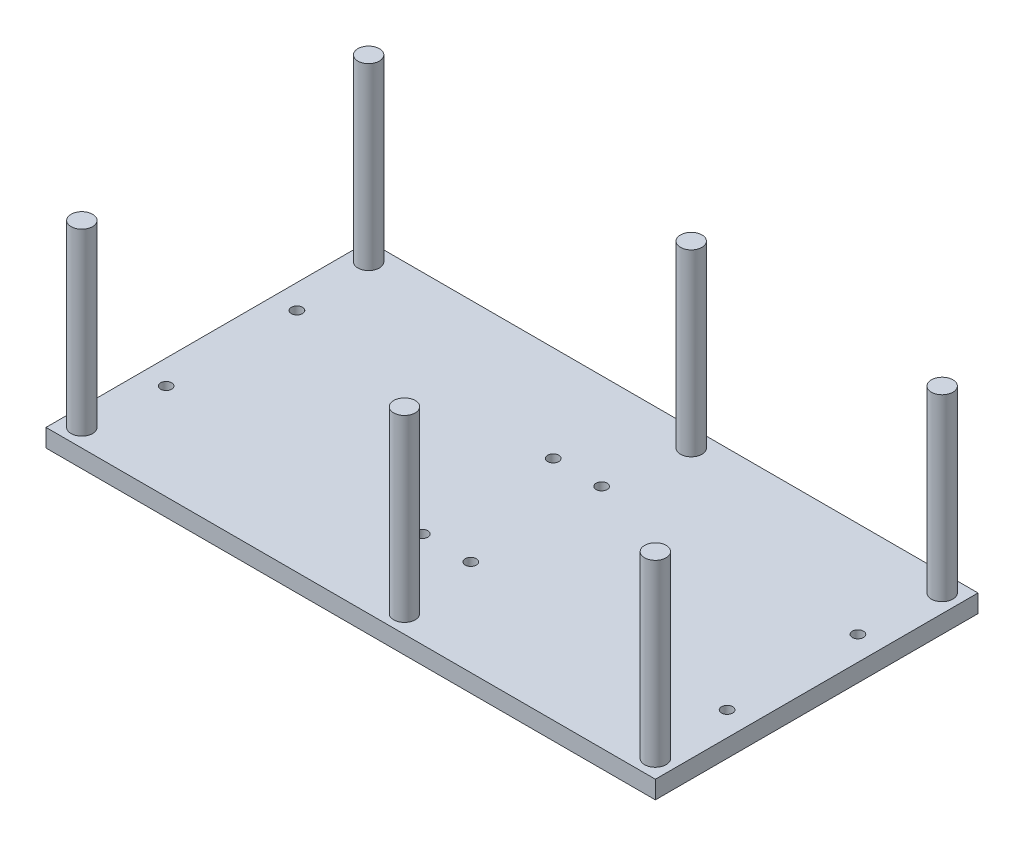
ISO-10303-21;
HEADER;
FILE_DESCRIPTION(('STEP AP214'),'2;1');
FILE_NAME('part.step','',(''),(''),'','','');
FILE_SCHEMA(('AUTOMOTIVE_DESIGN { 1 0 10303 214 1 1 1 1 }'));
ENDSEC;
DATA;
#1=APPLICATION_CONTEXT('core data for automotive mechanical design processes');
#2=APPLICATION_PROTOCOL_DEFINITION('international standard','automotive_design',2000,#1);
#3=PRODUCT_CONTEXT('',#1,'mechanical');
#4=PRODUCT('Part','Part','',(#3));
#5=PRODUCT_RELATED_PRODUCT_CATEGORY('part','',(#4));
#6=PRODUCT_DEFINITION_FORMATION('','',#4);
#7=PRODUCT_DEFINITION_CONTEXT('part definition',#1,'design');
#8=PRODUCT_DEFINITION('design','',#6,#7);
#9=PRODUCT_DEFINITION_SHAPE('','',#8);
#10=(LENGTH_UNIT() NAMED_UNIT(*) SI_UNIT(.MILLI.,.METRE.));
#11=(NAMED_UNIT(*) PLANE_ANGLE_UNIT() SI_UNIT($,.RADIAN.));
#12=(NAMED_UNIT(*) SI_UNIT($,.STERADIAN.) SOLID_ANGLE_UNIT());
#13=UNCERTAINTY_MEASURE_WITH_UNIT(LENGTH_MEASURE(1.E-05),#10,'distance_accuracy_value','');
#14=(GEOMETRIC_REPRESENTATION_CONTEXT(3) GLOBAL_UNCERTAINTY_ASSIGNED_CONTEXT((#13)) GLOBAL_UNIT_ASSIGNED_CONTEXT((#10,
#11,#12)) REPRESENTATION_CONTEXT('',''));
#15=CARTESIAN_POINT('',(0.,0.,0.));
#16=DIRECTION('',(0.,0.,1.));
#17=DIRECTION('',(1.,0.,0.));
#18=AXIS2_PLACEMENT_3D('',#15,#16,#17);
#19=CARTESIAN_POINT('',(0.,5.,0.));
#20=DIRECTION('',(1.,0.,0.));
#21=DIRECTION('',(0.,0.,-1.));
#22=AXIS2_PLACEMENT_3D('',#19,#20,#21);
#23=PLANE('',#22);
#24=DIRECTION('',(0.,0.,1.));
#25=VECTOR('',#24,1.);
#26=CARTESIAN_POINT('',(0.,0.,0.));
#27=LINE('',#26,#25);
#28=CARTESIAN_POINT('',(0.,0.,-90.));
#29=VERTEX_POINT('',#28);
#30=CARTESIAN_POINT('',(0.,0.,0.));
#31=VERTEX_POINT('',#30);
#32=EDGE_CURVE('E115',#29,#31,#27,.T.);
#33=ORIENTED_EDGE('',*,*,#32,.T.);
#34=DIRECTION('',(0.,-1.,0.));
#35=VECTOR('',#34,1.);
#36=CARTESIAN_POINT('',(0.,5.,0.));
#37=LINE('',#36,#35);
#38=CARTESIAN_POINT('',(0.,5.,0.));
#39=VERTEX_POINT('',#38);
#40=EDGE_CURVE('E104',#39,#31,#37,.T.);
#41=ORIENTED_EDGE('',*,*,#40,.F.);
#42=DIRECTION('',(0.,0.,1.));
#43=VECTOR('',#42,1.);
#44=CARTESIAN_POINT('',(0.,5.,0.));
#45=LINE('',#44,#43);
#46=CARTESIAN_POINT('',(0.,5.,-90.));
#47=VERTEX_POINT('',#46);
#48=EDGE_CURVE('E96',#47,#39,#45,.T.);
#49=ORIENTED_EDGE('',*,*,#48,.F.);
#50=DIRECTION('',(0.,-1.,0.));
#51=VECTOR('',#50,1.);
#52=CARTESIAN_POINT('',(0.,5.,-90.));
#53=LINE('',#52,#51);
#54=EDGE_CURVE('E111',#47,#29,#53,.T.);
#55=ORIENTED_EDGE('',*,*,#54,.T.);
#56=EDGE_LOOP('',(#33,#41,#49,#55));
#57=FACE_BOUND('',#56,.T.);
#58=ADVANCED_FACE('F43',(#57),#23,.F.);
#59=CARTESIAN_POINT('',(0.,5.,0.));
#60=DIRECTION('',(0.,0.,-1.));
#61=DIRECTION('',(-1.,0.,0.));
#62=AXIS2_PLACEMENT_3D('',#59,#60,#61);
#63=PLANE('',#62);
#64=DIRECTION('',(1.,0.,0.));
#65=VECTOR('',#64,1.);
#66=CARTESIAN_POINT('',(0.,0.,0.));
#67=LINE('',#66,#65);
#68=CARTESIAN_POINT('',(170.,0.,0.));
#69=VERTEX_POINT('',#68);
#70=EDGE_CURVE('E102',#31,#69,#67,.T.);
#71=ORIENTED_EDGE('',*,*,#70,.T.);
#72=DIRECTION('',(0.,-1.,0.));
#73=VECTOR('',#72,1.);
#74=CARTESIAN_POINT('',(170.,5.,0.));
#75=LINE('',#74,#73);
#76=CARTESIAN_POINT('',(170.,5.,0.));
#77=VERTEX_POINT('',#76);
#78=EDGE_CURVE('E100',#77,#69,#75,.T.);
#79=ORIENTED_EDGE('',*,*,#78,.F.);
#80=DIRECTION('',(1.,0.,0.));
#81=VECTOR('',#80,1.);
#82=CARTESIAN_POINT('',(0.,5.,0.));
#83=LINE('',#82,#81);
#84=EDGE_CURVE('E91',#39,#77,#83,.T.);
#85=ORIENTED_EDGE('',*,*,#84,.F.);
#86=ORIENTED_EDGE('',*,*,#40,.T.);
#87=EDGE_LOOP('',(#71,#79,#85,#86));
#88=FACE_BOUND('',#87,.T.);
#89=ADVANCED_FACE('F101',(#88),#63,.F.);
#90=CARTESIAN_POINT('',(170.,5.,0.));
#91=DIRECTION('',(-1.,0.,0.));
#92=DIRECTION('',(0.,0.,1.));
#93=AXIS2_PLACEMENT_3D('',#90,#91,#92);
#94=PLANE('',#93);
#95=DIRECTION('',(0.,0.,-1.));
#96=VECTOR('',#95,1.);
#97=CARTESIAN_POINT('',(170.,0.,0.));
#98=LINE('',#97,#96);
#99=CARTESIAN_POINT('',(170.,0.,-90.));
#100=VERTEX_POINT('',#99);
#101=EDGE_CURVE('E77',#69,#100,#98,.T.);
#102=ORIENTED_EDGE('',*,*,#101,.T.);
#103=DIRECTION('',(0.,-1.,0.));
#104=VECTOR('',#103,1.);
#105=CARTESIAN_POINT('',(170.,5.,-90.));
#106=LINE('',#105,#104);
#107=CARTESIAN_POINT('',(170.,5.,-90.));
#108=VERTEX_POINT('',#107);
#109=EDGE_CURVE('E105',#108,#100,#106,.T.);
#110=ORIENTED_EDGE('',*,*,#109,.F.);
#111=DIRECTION('',(0.,0.,-1.));
#112=VECTOR('',#111,1.);
#113=CARTESIAN_POINT('',(170.,5.,0.));
#114=LINE('',#113,#112);
#115=EDGE_CURVE('E94',#77,#108,#114,.T.);
#116=ORIENTED_EDGE('',*,*,#115,.F.);
#117=ORIENTED_EDGE('',*,*,#78,.T.);
#118=EDGE_LOOP('',(#102,#110,#116,#117));
#119=FACE_BOUND('',#118,.T.);
#120=ADVANCED_FACE('F107',(#119),#94,.F.);
#121=CARTESIAN_POINT('',(0.,5.,-90.));
#122=DIRECTION('',(0.,0.,1.));
#123=DIRECTION('',(1.,0.,0.));
#124=AXIS2_PLACEMENT_3D('',#121,#122,#123);
#125=PLANE('',#124);
#126=DIRECTION('',(-1.,0.,0.));
#127=VECTOR('',#126,1.);
#128=CARTESIAN_POINT('',(0.,0.,-90.));
#129=LINE('',#128,#127);
#130=EDGE_CURVE('E83',#100,#29,#129,.T.);
#131=ORIENTED_EDGE('',*,*,#130,.T.);
#132=ORIENTED_EDGE('',*,*,#54,.F.);
#133=DIRECTION('',(-1.,0.,0.));
#134=VECTOR('',#133,1.);
#135=CARTESIAN_POINT('',(0.,5.,-90.));
#136=LINE('',#135,#134);
#137=EDGE_CURVE('E60',#108,#47,#136,.T.);
#138=ORIENTED_EDGE('',*,*,#137,.F.);
#139=ORIENTED_EDGE('',*,*,#109,.T.);
#140=EDGE_LOOP('',(#131,#132,#138,#139));
#141=FACE_BOUND('',#140,.T.);
#142=ADVANCED_FACE('F156',(#141),#125,.F.);
#143=CARTESIAN_POINT('',(0.,5.,0.));
#144=DIRECTION('',(0.,-1.,0.));
#145=DIRECTION('',(0.,0.,-1.));
#146=AXIS2_PLACEMENT_3D('',#143,#144,#145);
#147=PLANE('',#146);
#148=CARTESIAN_POINT('',(163.25,5.,-63.25));
#149=DIRECTION('',(0.,-1.,0.));
#150=DIRECTION('',(0.,0.,-1.));
#151=AXIS2_PLACEMENT_3D('',#148,#149,#150);
#152=CIRCLE('',#151,1.55000000000002);
#153=CARTESIAN_POINT('',(163.25,5.,-64.8));
#154=VERTEX_POINT('',#153);
#155=EDGE_CURVE('E473',#154,#154,#152,.T.);
#156=ORIENTED_EDGE('',*,*,#155,.T.);
#157=EDGE_LOOP('',(#156));
#158=FACE_BOUND('',#157,.T.);
#159=CARTESIAN_POINT('',(6.75000000000001,5.,-63.25));
#160=DIRECTION('',(0.,-1.,0.));
#161=DIRECTION('',(0.,0.,-1.));
#162=AXIS2_PLACEMENT_3D('',#159,#160,#161);
#163=CIRCLE('',#162,1.55);
#164=CARTESIAN_POINT('',(6.75000000000001,5.,-64.8));
#165=VERTEX_POINT('',#164);
#166=EDGE_CURVE('E476',#165,#165,#163,.T.);
#167=ORIENTED_EDGE('',*,*,#166,.T.);
#168=EDGE_LOOP('',(#167));
#169=FACE_BOUND('',#168,.T.);
#170=CARTESIAN_POINT('',(78.25,5.,-63.25));
#171=DIRECTION('',(0.,-1.,0.));
#172=DIRECTION('',(0.,0.,-1.));
#173=AXIS2_PLACEMENT_3D('',#170,#171,#172);
#174=CIRCLE('',#173,1.54999999999999);
#175=CARTESIAN_POINT('',(78.25,5.,-64.8));
#176=VERTEX_POINT('',#175);
#177=EDGE_CURVE('E484',#176,#176,#174,.T.);
#178=ORIENTED_EDGE('',*,*,#177,.T.);
#179=EDGE_LOOP('',(#178));
#180=FACE_BOUND('',#179,.T.);
#181=CARTESIAN_POINT('',(78.25,5.,-26.75));
#182=DIRECTION('',(0.,-1.,0.));
#183=DIRECTION('',(0.,0.,-1.));
#184=AXIS2_PLACEMENT_3D('',#181,#182,#183);
#185=CIRCLE('',#184,1.54999999999999);
#186=CARTESIAN_POINT('',(78.25,5.,-28.3));
#187=VERTEX_POINT('',#186);
#188=EDGE_CURVE('E516',#187,#187,#185,.T.);
#189=ORIENTED_EDGE('',*,*,#188,.T.);
#190=EDGE_LOOP('',(#189));
#191=FACE_BOUND('',#190,.T.);
#192=CARTESIAN_POINT('',(91.75,5.,-63.2499999999999));
#193=DIRECTION('',(0.,-1.,0.));
#194=DIRECTION('',(0.,0.,-1.));
#195=AXIS2_PLACEMENT_3D('',#192,#193,#194);
#196=CIRCLE('',#195,1.54999999999999);
#197=CARTESIAN_POINT('',(91.75,5.,-64.7999999999999));
#198=VERTEX_POINT('',#197);
#199=EDGE_CURVE('E520',#198,#198,#196,.T.);
#200=ORIENTED_EDGE('',*,*,#199,.T.);
#201=EDGE_LOOP('',(#200));
#202=FACE_BOUND('',#201,.T.);
#203=CARTESIAN_POINT('',(91.75,5.,-26.75));
#204=DIRECTION('',(0.,-1.,0.));
#205=DIRECTION('',(0.,0.,-1.));
#206=AXIS2_PLACEMENT_3D('',#203,#204,#205);
#207=CIRCLE('',#206,1.54999999999999);
#208=CARTESIAN_POINT('',(91.75,5.,-28.3));
#209=VERTEX_POINT('',#208);
#210=EDGE_CURVE('E524',#209,#209,#207,.T.);
#211=ORIENTED_EDGE('',*,*,#210,.T.);
#212=EDGE_LOOP('',(#211));
#213=FACE_BOUND('',#212,.T.);
#214=CARTESIAN_POINT('',(163.25,5.,-26.75));
#215=DIRECTION('',(0.,-1.,0.));
#216=DIRECTION('',(0.,0.,-1.));
#217=AXIS2_PLACEMENT_3D('',#214,#215,#216);
#218=CIRCLE('',#217,1.54999999999999);
#219=CARTESIAN_POINT('',(163.25,5.,-28.3));
#220=VERTEX_POINT('',#219);
#221=EDGE_CURVE('E528',#220,#220,#218,.T.);
#222=ORIENTED_EDGE('',*,*,#221,.T.);
#223=EDGE_LOOP('',(#222));
#224=FACE_BOUND('',#223,.T.);
#225=CARTESIAN_POINT('',(6.75,5.,-26.75));
#226=DIRECTION('',(0.,-1.,0.));
#227=DIRECTION('',(0.,0.,-1.));
#228=AXIS2_PLACEMENT_3D('',#225,#226,#227);
#229=CIRCLE('',#228,1.55);
#230=CARTESIAN_POINT('',(6.75,5.,-28.3));
#231=VERTEX_POINT('',#230);
#232=EDGE_CURVE('E532',#231,#231,#229,.T.);
#233=ORIENTED_EDGE('',*,*,#232,.T.);
#234=EDGE_LOOP('',(#233));
#235=FACE_BOUND('',#234,.T.);
#236=CARTESIAN_POINT('',(95.,5.,-5.));
#237=DIRECTION('',(0.,-1.,0.));
#238=DIRECTION('',(0.,0.,-1.));
#239=AXIS2_PLACEMENT_3D('',#236,#237,#238);
#240=CIRCLE('',#239,3.00000000000001);
#241=CARTESIAN_POINT('',(95.,5.,-8.00000000000001));
#242=VERTEX_POINT('',#241);
#243=EDGE_CURVE('E11',#242,#242,#240,.F.);
#244=ORIENTED_EDGE('',*,*,#243,.F.);
#245=EDGE_LOOP('',(#244));
#246=FACE_BOUND('',#245,.T.);
#247=CARTESIAN_POINT('',(95.,5.,-85.));
#248=DIRECTION('',(0.,-1.,0.));
#249=DIRECTION('',(0.,0.,-1.));
#250=AXIS2_PLACEMENT_3D('',#247,#248,#249);
#251=CIRCLE('',#250,3.00000000000001);
#252=CARTESIAN_POINT('',(95.,5.,-88.));
#253=VERTEX_POINT('',#252);
#254=EDGE_CURVE('E52',#253,#253,#251,.F.);
#255=ORIENTED_EDGE('',*,*,#254,.F.);
#256=EDGE_LOOP('',(#255));
#257=FACE_BOUND('',#256,.T.);
#258=CARTESIAN_POINT('',(165.,5.,-85.));
#259=DIRECTION('',(0.,-1.,0.));
#260=DIRECTION('',(0.,0.,-1.));
#261=AXIS2_PLACEMENT_3D('',#258,#259,#260);
#262=CIRCLE('',#261,2.99999999999999);
#263=CARTESIAN_POINT('',(165.,5.,-88.));
#264=VERTEX_POINT('',#263);
#265=EDGE_CURVE('E144',#264,#264,#262,.F.);
#266=ORIENTED_EDGE('',*,*,#265,.F.);
#267=EDGE_LOOP('',(#266));
#268=FACE_BOUND('',#267,.T.);
#269=CARTESIAN_POINT('',(165.,5.,-5.00000000000009));
#270=DIRECTION('',(0.,-1.,0.));
#271=DIRECTION('',(0.,0.,-1.));
#272=AXIS2_PLACEMENT_3D('',#269,#270,#271);
#273=CIRCLE('',#272,2.99999999999997);
#274=CARTESIAN_POINT('',(165.,5.,-8.00000000000006));
#275=VERTEX_POINT('',#274);
#276=EDGE_CURVE('E140',#275,#275,#273,.F.);
#277=ORIENTED_EDGE('',*,*,#276,.F.);
#278=EDGE_LOOP('',(#277));
#279=FACE_BOUND('',#278,.T.);
#280=CARTESIAN_POINT('',(4.99999999999999,5.,-5.00000000000003));
#281=DIRECTION('',(0.,-1.,0.));
#282=DIRECTION('',(0.,0.,-1.));
#283=AXIS2_PLACEMENT_3D('',#280,#281,#282);
#284=CIRCLE('',#283,3.);
#285=CARTESIAN_POINT('',(4.99999999999999,5.,-8.00000000000003));
#286=VERTEX_POINT('',#285);
#287=EDGE_CURVE('E136',#286,#286,#284,.F.);
#288=ORIENTED_EDGE('',*,*,#287,.F.);
#289=EDGE_LOOP('',(#288));
#290=FACE_BOUND('',#289,.T.);
#291=CARTESIAN_POINT('',(5.,5.,-85.));
#292=DIRECTION('',(0.,-1.,0.));
#293=DIRECTION('',(0.,0.,-1.));
#294=AXIS2_PLACEMENT_3D('',#291,#292,#293);
#295=CIRCLE('',#294,3.);
#296=CARTESIAN_POINT('',(5.,5.,-88.));
#297=VERTEX_POINT('',#296);
#298=EDGE_CURVE('E132',#297,#297,#295,.F.);
#299=ORIENTED_EDGE('',*,*,#298,.F.);
#300=EDGE_LOOP('',(#299));
#301=FACE_BOUND('',#300,.T.);
#302=ORIENTED_EDGE('',*,*,#48,.T.);
#303=ORIENTED_EDGE('',*,*,#84,.T.);
#304=ORIENTED_EDGE('',*,*,#115,.T.);
#305=ORIENTED_EDGE('',*,*,#137,.T.);
#306=EDGE_LOOP('',(#302,#303,#304,#305));
#307=FACE_BOUND('',#306,.T.);
#308=ADVANCED_FACE('F92',(#158,#169,#180,#191,#202,#213,#224,#235,#246,#257,#268,#279,#290,#301,
#307),#147,.F.);
#309=CARTESIAN_POINT('',(0.,0.,0.));
#310=DIRECTION('',(0.,-1.,0.));
#311=DIRECTION('',(0.,0.,-1.));
#312=AXIS2_PLACEMENT_3D('',#309,#310,#311);
#313=PLANE('',#312);
#314=CARTESIAN_POINT('',(163.25,0.,-63.25));
#315=DIRECTION('',(0.,-1.,0.));
#316=DIRECTION('',(0.,0.,1.));
#317=AXIS2_PLACEMENT_3D('',#314,#315,#316);
#318=CIRCLE('',#317,1.55000000000002);
#319=CARTESIAN_POINT('',(163.25,0.,-61.6999999999999));
#320=VERTEX_POINT('',#319);
#321=EDGE_CURVE('E470',#320,#320,#318,.T.);
#322=ORIENTED_EDGE('',*,*,#321,.F.);
#323=EDGE_LOOP('',(#322));
#324=FACE_BOUND('',#323,.T.);
#325=CARTESIAN_POINT('',(6.75000000000001,0.,-63.25));
#326=DIRECTION('',(0.,-1.,0.));
#327=DIRECTION('',(0.,0.,-1.));
#328=AXIS2_PLACEMENT_3D('',#325,#326,#327);
#329=CIRCLE('',#328,1.55);
#330=CARTESIAN_POINT('',(6.75000000000001,0.,-64.8));
#331=VERTEX_POINT('',#330);
#332=EDGE_CURVE('E545',#331,#331,#329,.T.);
#333=ORIENTED_EDGE('',*,*,#332,.F.);
#334=EDGE_LOOP('',(#333));
#335=FACE_BOUND('',#334,.T.);
#336=CARTESIAN_POINT('',(78.25,0.,-63.25));
#337=DIRECTION('',(0.,-1.,0.));
#338=DIRECTION('',(0.,0.,-1.));
#339=AXIS2_PLACEMENT_3D('',#336,#337,#338);
#340=CIRCLE('',#339,1.54999999999999);
#341=CARTESIAN_POINT('',(78.25,0.,-64.8));
#342=VERTEX_POINT('',#341);
#343=EDGE_CURVE('E541',#342,#342,#340,.T.);
#344=ORIENTED_EDGE('',*,*,#343,.F.);
#345=EDGE_LOOP('',(#344));
#346=FACE_BOUND('',#345,.T.);
#347=CARTESIAN_POINT('',(78.25,0.,-26.75));
#348=DIRECTION('',(0.,-1.,0.));
#349=DIRECTION('',(0.,0.,-1.));
#350=AXIS2_PLACEMENT_3D('',#347,#348,#349);
#351=CIRCLE('',#350,1.54999999999999);
#352=CARTESIAN_POINT('',(78.25,0.,-28.3));
#353=VERTEX_POINT('',#352);
#354=EDGE_CURVE('E540',#353,#353,#351,.T.);
#355=ORIENTED_EDGE('',*,*,#354,.F.);
#356=EDGE_LOOP('',(#355));
#357=FACE_BOUND('',#356,.T.);
#358=CARTESIAN_POINT('',(91.75,0.,-63.2499999999999));
#359=DIRECTION('',(0.,-1.,0.));
#360=DIRECTION('',(0.,0.,1.));
#361=AXIS2_PLACEMENT_3D('',#358,#359,#360);
#362=CIRCLE('',#361,1.54999999999999);
#363=CARTESIAN_POINT('',(91.75,0.,-61.6999999999999));
#364=VERTEX_POINT('',#363);
#365=EDGE_CURVE('E551',#364,#364,#362,.T.);
#366=ORIENTED_EDGE('',*,*,#365,.F.);
#367=EDGE_LOOP('',(#366));
#368=FACE_BOUND('',#367,.T.);
#369=CARTESIAN_POINT('',(91.75,0.,-26.75));
#370=DIRECTION('',(0.,-1.,0.));
#371=DIRECTION('',(0.,0.,1.));
#372=AXIS2_PLACEMENT_3D('',#369,#370,#371);
#373=CIRCLE('',#372,1.54999999999999);
#374=CARTESIAN_POINT('',(91.75,0.,-25.2));
#375=VERTEX_POINT('',#374);
#376=EDGE_CURVE('E559',#375,#375,#373,.T.);
#377=ORIENTED_EDGE('',*,*,#376,.F.);
#378=EDGE_LOOP('',(#377));
#379=FACE_BOUND('',#378,.T.);
#380=CARTESIAN_POINT('',(163.25,0.,-26.75));
#381=DIRECTION('',(0.,-1.,0.));
#382=DIRECTION('',(0.,0.,1.));
#383=AXIS2_PLACEMENT_3D('',#380,#381,#382);
#384=CIRCLE('',#383,1.54999999999999);
#385=CARTESIAN_POINT('',(163.25,0.,-25.2));
#386=VERTEX_POINT('',#385);
#387=EDGE_CURVE('E555',#386,#386,#384,.T.);
#388=ORIENTED_EDGE('',*,*,#387,.F.);
#389=EDGE_LOOP('',(#388));
#390=FACE_BOUND('',#389,.T.);
#391=CARTESIAN_POINT('',(6.75,0.,-26.75));
#392=DIRECTION('',(0.,-1.,0.));
#393=DIRECTION('',(0.,0.,-1.));
#394=AXIS2_PLACEMENT_3D('',#391,#392,#393);
#395=CIRCLE('',#394,1.55);
#396=CARTESIAN_POINT('',(6.75,0.,-28.3));
#397=VERTEX_POINT('',#396);
#398=EDGE_CURVE('E536',#397,#397,#395,.T.);
#399=ORIENTED_EDGE('',*,*,#398,.F.);
#400=EDGE_LOOP('',(#399));
#401=FACE_BOUND('',#400,.T.);
#402=ORIENTED_EDGE('',*,*,#32,.F.);
#403=ORIENTED_EDGE('',*,*,#130,.F.);
#404=ORIENTED_EDGE('',*,*,#101,.F.);
#405=ORIENTED_EDGE('',*,*,#70,.F.);
#406=EDGE_LOOP('',(#402,#403,#404,#405));
#407=FACE_BOUND('',#406,.T.);
#408=ADVANCED_FACE('F155',(#324,#335,#346,#357,#368,#379,#390,#401,#407),#313,.T.);
#409=CARTESIAN_POINT('',(5.,55.,-85.));
#410=DIRECTION('',(0.,-1.,0.));
#411=DIRECTION('',(0.,0.,-1.));
#412=AXIS2_PLACEMENT_3D('',#409,#410,#411);
#413=CYLINDRICAL_SURFACE('',#412,3.);
#414=CARTESIAN_POINT('',(5.,55.,-85.));
#415=DIRECTION('',(0.,1.,0.));
#416=DIRECTION('',(0.,0.,1.));
#417=AXIS2_PLACEMENT_3D('',#414,#415,#416);
#418=CIRCLE('',#417,3.);
#419=CARTESIAN_POINT('',(5.,55.,-82.));
#420=VERTEX_POINT('',#419);
#421=EDGE_CURVE('E119',#420,#420,#418,.T.);
#422=ORIENTED_EDGE('',*,*,#421,.F.);
#423=EDGE_LOOP('',(#422));
#424=FACE_BOUND('',#423,.T.);
#425=ORIENTED_EDGE('',*,*,#298,.T.);
#426=EDGE_LOOP('',(#425));
#427=FACE_BOUND('',#426,.T.);
#428=ADVANCED_FACE('F167',(#424,#427),#413,.T.);
#429=CARTESIAN_POINT('',(5.,55.,-85.));
#430=DIRECTION('',(0.,1.,0.));
#431=DIRECTION('',(0.,0.,1.));
#432=AXIS2_PLACEMENT_3D('',#429,#430,#431);
#433=PLANE('',#432);
#434=ORIENTED_EDGE('',*,*,#421,.T.);
#435=EDGE_LOOP('',(#434));
#436=FACE_BOUND('',#435,.T.);
#437=ADVANCED_FACE('F169',(#436),#433,.T.);
#438=CARTESIAN_POINT('',(4.99999999999999,55.,-5.00000000000003));
#439=DIRECTION('',(0.,-1.,0.));
#440=DIRECTION('',(0.,0.,-1.));
#441=AXIS2_PLACEMENT_3D('',#438,#439,#440);
#442=CYLINDRICAL_SURFACE('',#441,3.);
#443=CARTESIAN_POINT('',(4.99999999999999,55.,-5.00000000000003));
#444=DIRECTION('',(0.,1.,0.));
#445=DIRECTION('',(0.,0.,-1.));
#446=AXIS2_PLACEMENT_3D('',#443,#444,#445);
#447=CIRCLE('',#446,3.);
#448=CARTESIAN_POINT('',(4.99999999999999,55.,-8.00000000000003));
#449=VERTEX_POINT('',#448);
#450=EDGE_CURVE('E499',#449,#449,#447,.T.);
#451=ORIENTED_EDGE('',*,*,#450,.F.);
#452=EDGE_LOOP('',(#451));
#453=FACE_BOUND('',#452,.T.);
#454=ORIENTED_EDGE('',*,*,#287,.T.);
#455=EDGE_LOOP('',(#454));
#456=FACE_BOUND('',#455,.T.);
#457=ADVANCED_FACE('F176',(#453,#456),#442,.T.);
#458=CARTESIAN_POINT('',(4.99999999999999,55.,-5.00000000000003));
#459=DIRECTION('',(0.,-1.,0.));
#460=DIRECTION('',(0.,0.,-1.));
#461=AXIS2_PLACEMENT_3D('',#458,#459,#460);
#462=PLANE('',#461);
#463=ORIENTED_EDGE('',*,*,#450,.T.);
#464=EDGE_LOOP('',(#463));
#465=FACE_BOUND('',#464,.T.);
#466=ADVANCED_FACE('F250',(#465),#462,.F.);
#467=CARTESIAN_POINT('',(165.,55.,-5.00000000000009));
#468=DIRECTION('',(0.,-1.,0.));
#469=DIRECTION('',(0.,0.,-1.));
#470=AXIS2_PLACEMENT_3D('',#467,#468,#469);
#471=CYLINDRICAL_SURFACE('',#470,2.99999999999997);
#472=CARTESIAN_POINT('',(165.,55.,-5.00000000000009));
#473=DIRECTION('',(0.,1.,0.));
#474=DIRECTION('',(0.,0.,1.));
#475=AXIS2_PLACEMENT_3D('',#472,#473,#474);
#476=CIRCLE('',#475,2.99999999999997);
#477=CARTESIAN_POINT('',(165.,55.,-2.00000000000012));
#478=VERTEX_POINT('',#477);
#479=EDGE_CURVE('E495',#478,#478,#476,.T.);
#480=ORIENTED_EDGE('',*,*,#479,.F.);
#481=EDGE_LOOP('',(#480));
#482=FACE_BOUND('',#481,.T.);
#483=ORIENTED_EDGE('',*,*,#276,.T.);
#484=EDGE_LOOP('',(#483));
#485=FACE_BOUND('',#484,.T.);
#486=ADVANCED_FACE('F260',(#482,#485),#471,.T.);
#487=CARTESIAN_POINT('',(165.,55.,-5.00000000000009));
#488=DIRECTION('',(0.,1.,0.));
#489=DIRECTION('',(0.,0.,1.));
#490=AXIS2_PLACEMENT_3D('',#487,#488,#489);
#491=PLANE('',#490);
#492=ORIENTED_EDGE('',*,*,#479,.T.);
#493=EDGE_LOOP('',(#492));
#494=FACE_BOUND('',#493,.T.);
#495=ADVANCED_FACE('F270',(#494),#491,.T.);
#496=CARTESIAN_POINT('',(165.,55.,-85.));
#497=DIRECTION('',(0.,-1.,0.));
#498=DIRECTION('',(0.,0.,-1.));
#499=AXIS2_PLACEMENT_3D('',#496,#497,#498);
#500=CYLINDRICAL_SURFACE('',#499,2.99999999999999);
#501=CARTESIAN_POINT('',(165.,55.,-85.));
#502=DIRECTION('',(0.,1.,0.));
#503=DIRECTION('',(0.,0.,-1.));
#504=AXIS2_PLACEMENT_3D('',#501,#502,#503);
#505=CIRCLE('',#504,2.99999999999999);
#506=CARTESIAN_POINT('',(165.,55.,-88.));
#507=VERTEX_POINT('',#506);
#508=EDGE_CURVE('E491',#507,#507,#505,.T.);
#509=ORIENTED_EDGE('',*,*,#508,.F.);
#510=EDGE_LOOP('',(#509));
#511=FACE_BOUND('',#510,.T.);
#512=ORIENTED_EDGE('',*,*,#265,.T.);
#513=EDGE_LOOP('',(#512));
#514=FACE_BOUND('',#513,.T.);
#515=ADVANCED_FACE('F280',(#511,#514),#500,.T.);
#516=CARTESIAN_POINT('',(165.,55.,-85.));
#517=DIRECTION('',(0.,-1.,0.));
#518=DIRECTION('',(0.,0.,-1.));
#519=AXIS2_PLACEMENT_3D('',#516,#517,#518);
#520=PLANE('',#519);
#521=ORIENTED_EDGE('',*,*,#508,.T.);
#522=EDGE_LOOP('',(#521));
#523=FACE_BOUND('',#522,.T.);
#524=ADVANCED_FACE('F290',(#523),#520,.F.);
#525=CARTESIAN_POINT('',(95.,55.,-85.));
#526=DIRECTION('',(0.,-1.,0.));
#527=DIRECTION('',(0.,0.,-1.));
#528=AXIS2_PLACEMENT_3D('',#525,#526,#527);
#529=CYLINDRICAL_SURFACE('',#528,3.00000000000001);
#530=CARTESIAN_POINT('',(95.,55.,-85.));
#531=DIRECTION('',(0.,1.,0.));
#532=DIRECTION('',(0.,0.,1.));
#533=AXIS2_PLACEMENT_3D('',#530,#531,#532);
#534=CIRCLE('',#533,3.00000000000001);
#535=CARTESIAN_POINT('',(95.,55.,-82.));
#536=VERTEX_POINT('',#535);
#537=EDGE_CURVE('E481',#536,#536,#534,.T.);
#538=ORIENTED_EDGE('',*,*,#537,.F.);
#539=EDGE_LOOP('',(#538));
#540=FACE_BOUND('',#539,.T.);
#541=ORIENTED_EDGE('',*,*,#254,.T.);
#542=EDGE_LOOP('',(#541));
#543=FACE_BOUND('',#542,.T.);
#544=ADVANCED_FACE('F151',(#540,#543),#529,.T.);
#545=CARTESIAN_POINT('',(95.,55.,-85.));
#546=DIRECTION('',(0.,1.,0.));
#547=DIRECTION('',(0.,0.,1.));
#548=AXIS2_PLACEMENT_3D('',#545,#546,#547);
#549=PLANE('',#548);
#550=ORIENTED_EDGE('',*,*,#537,.T.);
#551=EDGE_LOOP('',(#550));
#552=FACE_BOUND('',#551,.T.);
#553=ADVANCED_FACE('F309',(#552),#549,.T.);
#554=CARTESIAN_POINT('',(95.,55.,-5.));
#555=DIRECTION('',(0.,-1.,0.));
#556=DIRECTION('',(0.,0.,-1.));
#557=AXIS2_PLACEMENT_3D('',#554,#555,#556);
#558=CYLINDRICAL_SURFACE('',#557,3.00000000000001);
#559=CARTESIAN_POINT('',(95.,55.,-5.));
#560=DIRECTION('',(0.,1.,0.));
#561=DIRECTION('',(0.,0.,-1.));
#562=AXIS2_PLACEMENT_3D('',#559,#560,#561);
#563=CIRCLE('',#562,3.00000000000001);
#564=CARTESIAN_POINT('',(95.,55.,-8.00000000000001));
#565=VERTEX_POINT('',#564);
#566=EDGE_CURVE('E475',#565,#565,#563,.T.);
#567=ORIENTED_EDGE('',*,*,#566,.F.);
#568=EDGE_LOOP('',(#567));
#569=FACE_BOUND('',#568,.T.);
#570=ORIENTED_EDGE('',*,*,#243,.T.);
#571=EDGE_LOOP('',(#570));
#572=FACE_BOUND('',#571,.T.);
#573=ADVANCED_FACE('F319',(#569,#572),#558,.T.);
#574=CARTESIAN_POINT('',(95.,55.,-5.));
#575=DIRECTION('',(0.,-1.,0.));
#576=DIRECTION('',(0.,0.,-1.));
#577=AXIS2_PLACEMENT_3D('',#574,#575,#576);
#578=PLANE('',#577);
#579=ORIENTED_EDGE('',*,*,#566,.T.);
#580=EDGE_LOOP('',(#579));
#581=FACE_BOUND('',#580,.T.);
#582=ADVANCED_FACE('F329',(#581),#578,.F.);
#583=CARTESIAN_POINT('',(6.75,50.,-26.75));
#584=DIRECTION('',(0.,-1.,0.));
#585=DIRECTION('',(0.,0.,-1.));
#586=AXIS2_PLACEMENT_3D('',#583,#584,#585);
#587=CYLINDRICAL_SURFACE('',#586,1.55);
#588=ORIENTED_EDGE('',*,*,#398,.T.);
#589=EDGE_LOOP('',(#588));
#590=FACE_BOUND('',#589,.T.);
#591=ORIENTED_EDGE('',*,*,#232,.F.);
#592=EDGE_LOOP('',(#591));
#593=FACE_BOUND('',#592,.T.);
#594=ADVANCED_FACE('F339',(#590,#593),#587,.F.);
#595=CARTESIAN_POINT('',(163.25,50.,-26.75));
#596=DIRECTION('',(0.,-1.,0.));
#597=DIRECTION('',(0.,0.,-1.));
#598=AXIS2_PLACEMENT_3D('',#595,#596,#597);
#599=CYLINDRICAL_SURFACE('',#598,1.54999999999999);
#600=ORIENTED_EDGE('',*,*,#387,.T.);
#601=EDGE_LOOP('',(#600));
#602=FACE_BOUND('',#601,.T.);
#603=ORIENTED_EDGE('',*,*,#221,.F.);
#604=EDGE_LOOP('',(#603));
#605=FACE_BOUND('',#604,.T.);
#606=ADVANCED_FACE('F349',(#602,#605),#599,.F.);
#607=CARTESIAN_POINT('',(91.75,50.,-26.75));
#608=DIRECTION('',(0.,-1.,0.));
#609=DIRECTION('',(0.,0.,-1.));
#610=AXIS2_PLACEMENT_3D('',#607,#608,#609);
#611=CYLINDRICAL_SURFACE('',#610,1.54999999999999);
#612=ORIENTED_EDGE('',*,*,#376,.T.);
#613=EDGE_LOOP('',(#612));
#614=FACE_BOUND('',#613,.T.);
#615=ORIENTED_EDGE('',*,*,#210,.F.);
#616=EDGE_LOOP('',(#615));
#617=FACE_BOUND('',#616,.T.);
#618=ADVANCED_FACE('F359',(#614,#617),#611,.F.);
#619=CARTESIAN_POINT('',(91.75,50.,-63.2499999999999));
#620=DIRECTION('',(0.,-1.,0.));
#621=DIRECTION('',(0.,0.,-1.));
#622=AXIS2_PLACEMENT_3D('',#619,#620,#621);
#623=CYLINDRICAL_SURFACE('',#622,1.54999999999999);
#624=ORIENTED_EDGE('',*,*,#365,.T.);
#625=EDGE_LOOP('',(#624));
#626=FACE_BOUND('',#625,.T.);
#627=ORIENTED_EDGE('',*,*,#199,.F.);
#628=EDGE_LOOP('',(#627));
#629=FACE_BOUND('',#628,.T.);
#630=ADVANCED_FACE('F369',(#626,#629),#623,.F.);
#631=CARTESIAN_POINT('',(78.25,50.,-26.75));
#632=DIRECTION('',(0.,-1.,0.));
#633=DIRECTION('',(0.,0.,-1.));
#634=AXIS2_PLACEMENT_3D('',#631,#632,#633);
#635=CYLINDRICAL_SURFACE('',#634,1.54999999999999);
#636=ORIENTED_EDGE('',*,*,#354,.T.);
#637=EDGE_LOOP('',(#636));
#638=FACE_BOUND('',#637,.T.);
#639=ORIENTED_EDGE('',*,*,#188,.F.);
#640=EDGE_LOOP('',(#639));
#641=FACE_BOUND('',#640,.T.);
#642=ADVANCED_FACE('F379',(#638,#641),#635,.F.);
#643=CARTESIAN_POINT('',(78.25,50.,-63.25));
#644=DIRECTION('',(0.,-1.,0.));
#645=DIRECTION('',(0.,0.,-1.));
#646=AXIS2_PLACEMENT_3D('',#643,#644,#645);
#647=CYLINDRICAL_SURFACE('',#646,1.54999999999999);
#648=ORIENTED_EDGE('',*,*,#343,.T.);
#649=EDGE_LOOP('',(#648));
#650=FACE_BOUND('',#649,.T.);
#651=ORIENTED_EDGE('',*,*,#177,.F.);
#652=EDGE_LOOP('',(#651));
#653=FACE_BOUND('',#652,.T.);
#654=ADVANCED_FACE('F389',(#650,#653),#647,.F.);
#655=CARTESIAN_POINT('',(6.75000000000001,50.,-63.25));
#656=DIRECTION('',(0.,-1.,0.));
#657=DIRECTION('',(0.,0.,-1.));
#658=AXIS2_PLACEMENT_3D('',#655,#656,#657);
#659=CYLINDRICAL_SURFACE('',#658,1.55);
#660=ORIENTED_EDGE('',*,*,#332,.T.);
#661=EDGE_LOOP('',(#660));
#662=FACE_BOUND('',#661,.T.);
#663=ORIENTED_EDGE('',*,*,#166,.F.);
#664=EDGE_LOOP('',(#663));
#665=FACE_BOUND('',#664,.T.);
#666=ADVANCED_FACE('F399',(#662,#665),#659,.F.);
#667=CARTESIAN_POINT('',(163.25,50.,-63.25));
#668=DIRECTION('',(0.,-1.,0.));
#669=DIRECTION('',(0.,0.,-1.));
#670=AXIS2_PLACEMENT_3D('',#667,#668,#669);
#671=CYLINDRICAL_SURFACE('',#670,1.55000000000002);
#672=ORIENTED_EDGE('',*,*,#321,.T.);
#673=EDGE_LOOP('',(#672));
#674=FACE_BOUND('',#673,.T.);
#675=ORIENTED_EDGE('',*,*,#155,.F.);
#676=EDGE_LOOP('',(#675));
#677=FACE_BOUND('',#676,.T.);
#678=ADVANCED_FACE('F409',(#674,#677),#671,.F.);
#679=CLOSED_SHELL('',(#58,#89,#120,#142,#308,#408,#428,#437,#457,#466,#486,#495,#515,#524,#544,
#553,#573,#582,#594,#606,#618,#630,#642,#654,#666,#678));
#680=MANIFOLD_SOLID_BREP('B2',#679);
#681=ADVANCED_BREP_SHAPE_REPRESENTATION('',(#18,#680),#14);
#682=SHAPE_DEFINITION_REPRESENTATION(#9,#681);
ENDSEC;
END-ISO-10303-21;
